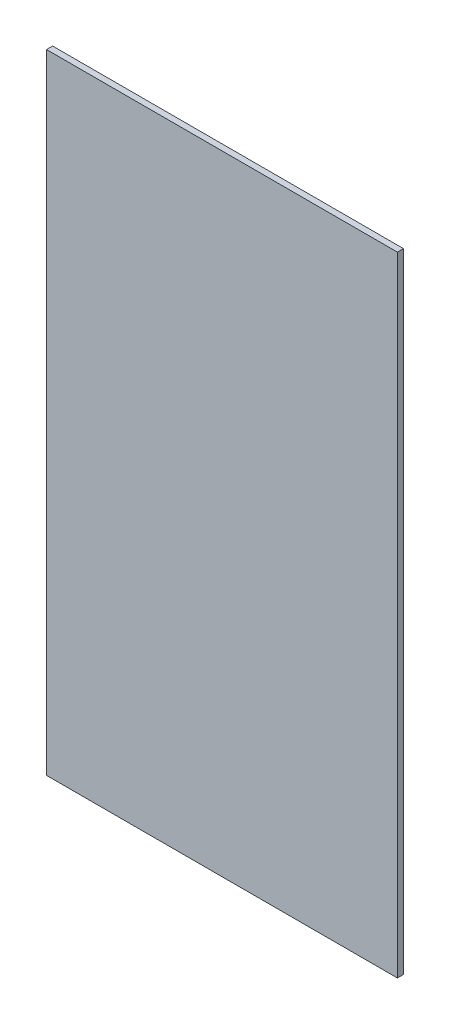
ISO-10303-21;
HEADER;
FILE_DESCRIPTION(('STEP AP214'),'2;1');
FILE_NAME('part.step','',(''),(''),'','','');
FILE_SCHEMA(('AUTOMOTIVE_DESIGN { 1 0 10303 214 1 1 1 1 }'));
ENDSEC;
DATA;
#1=APPLICATION_CONTEXT('core data for automotive mechanical design processes');
#2=APPLICATION_PROTOCOL_DEFINITION('international standard','automotive_design',2000,#1);
#3=PRODUCT_CONTEXT('',#1,'mechanical');
#4=PRODUCT('Part','Part','',(#3));
#5=PRODUCT_RELATED_PRODUCT_CATEGORY('part','',(#4));
#6=PRODUCT_DEFINITION_FORMATION('','',#4);
#7=PRODUCT_DEFINITION_CONTEXT('part definition',#1,'design');
#8=PRODUCT_DEFINITION('design','',#6,#7);
#9=PRODUCT_DEFINITION_SHAPE('','',#8);
#10=(LENGTH_UNIT() NAMED_UNIT(*) SI_UNIT(.MILLI.,.METRE.));
#11=(NAMED_UNIT(*) PLANE_ANGLE_UNIT() SI_UNIT($,.RADIAN.));
#12=(NAMED_UNIT(*) SI_UNIT($,.STERADIAN.) SOLID_ANGLE_UNIT());
#13=UNCERTAINTY_MEASURE_WITH_UNIT(LENGTH_MEASURE(1.E-05),#10,'distance_accuracy_value','');
#14=(GEOMETRIC_REPRESENTATION_CONTEXT(3) GLOBAL_UNCERTAINTY_ASSIGNED_CONTEXT((#13)) GLOBAL_UNIT_ASSIGNED_CONTEXT((#10,
#11,#12)) REPRESENTATION_CONTEXT('',''));
#15=CARTESIAN_POINT('',(0.,0.,0.));
#16=DIRECTION('',(0.,0.,1.));
#17=DIRECTION('',(1.,0.,0.));
#18=AXIS2_PLACEMENT_3D('',#15,#16,#17);
#19=CARTESIAN_POINT('',(57.5,103.,2.));
#20=DIRECTION('',(0.,-1.,0.));
#21=DIRECTION('',(0.,0.,-1.));
#22=AXIS2_PLACEMENT_3D('',#19,#20,#21);
#23=PLANE('',#22);
#24=DIRECTION('',(-1.,0.,0.));
#25=VECTOR('',#24,1.);
#26=CARTESIAN_POINT('',(57.5,103.,0.));
#27=LINE('',#26,#25);
#28=CARTESIAN_POINT('',(57.5,103.,0.));
#29=VERTEX_POINT('',#28);
#30=CARTESIAN_POINT('',(-57.5,103.,0.));
#31=VERTEX_POINT('',#30);
#32=EDGE_CURVE('E113',#29,#31,#27,.T.);
#33=ORIENTED_EDGE('',*,*,#32,.T.);
#34=DIRECTION('',(0.,0.,-1.));
#35=VECTOR('',#34,1.);
#36=CARTESIAN_POINT('',(-57.5,103.,2.));
#37=LINE('',#36,#35);
#38=CARTESIAN_POINT('',(-57.5,103.,2.));
#39=VERTEX_POINT('',#38);
#40=EDGE_CURVE('E11',#39,#31,#37,.T.);
#41=ORIENTED_EDGE('',*,*,#40,.F.);
#42=DIRECTION('',(-1.,0.,0.));
#43=VECTOR('',#42,1.);
#44=CARTESIAN_POINT('',(57.5,103.,2.));
#45=LINE('',#44,#43);
#46=CARTESIAN_POINT('',(57.5,103.,2.));
#47=VERTEX_POINT('',#46);
#48=EDGE_CURVE('E97',#47,#39,#45,.T.);
#49=ORIENTED_EDGE('',*,*,#48,.F.);
#50=DIRECTION('',(0.,0.,-1.));
#51=VECTOR('',#50,1.);
#52=CARTESIAN_POINT('',(57.5,103.,2.));
#53=LINE('',#52,#51);
#54=EDGE_CURVE('E109',#47,#29,#53,.T.);
#55=ORIENTED_EDGE('',*,*,#54,.T.);
#56=EDGE_LOOP('',(#33,#41,#49,#55));
#57=FACE_BOUND('',#56,.T.);
#58=ADVANCED_FACE('F45',(#57),#23,.F.);
#59=CARTESIAN_POINT('',(-57.5,-103.,2.));
#60=DIRECTION('',(1.,0.,0.));
#61=DIRECTION('',(0.,0.,-1.));
#62=AXIS2_PLACEMENT_3D('',#59,#60,#61);
#63=PLANE('',#62);
#64=DIRECTION('',(0.,-1.,0.));
#65=VECTOR('',#64,1.);
#66=CARTESIAN_POINT('',(-57.5,-103.,0.));
#67=LINE('',#66,#65);
#68=CARTESIAN_POINT('',(-57.5,-103.,0.));
#69=VERTEX_POINT('',#68);
#70=EDGE_CURVE('E102',#31,#69,#67,.T.);
#71=ORIENTED_EDGE('',*,*,#70,.T.);
#72=DIRECTION('',(0.,0.,-1.));
#73=VECTOR('',#72,1.);
#74=CARTESIAN_POINT('',(-57.5,-103.,2.));
#75=LINE('',#74,#73);
#76=CARTESIAN_POINT('',(-57.5,-103.,2.));
#77=VERTEX_POINT('',#76);
#78=EDGE_CURVE('E54',#77,#69,#75,.T.);
#79=ORIENTED_EDGE('',*,*,#78,.F.);
#80=DIRECTION('',(0.,-1.,0.));
#81=VECTOR('',#80,1.);
#82=CARTESIAN_POINT('',(-57.5,-103.,2.));
#83=LINE('',#82,#81);
#84=EDGE_CURVE('E92',#39,#77,#83,.T.);
#85=ORIENTED_EDGE('',*,*,#84,.F.);
#86=ORIENTED_EDGE('',*,*,#40,.T.);
#87=EDGE_LOOP('',(#71,#79,#85,#86));
#88=FACE_BOUND('',#87,.T.);
#89=ADVANCED_FACE('F101',(#88),#63,.F.);
#90=CARTESIAN_POINT('',(57.5,-103.,2.));
#91=DIRECTION('',(0.,1.,0.));
#92=DIRECTION('',(0.,0.,1.));
#93=AXIS2_PLACEMENT_3D('',#90,#91,#92);
#94=PLANE('',#93);
#95=DIRECTION('',(1.,0.,0.));
#96=VECTOR('',#95,1.);
#97=CARTESIAN_POINT('',(57.5,-103.,0.));
#98=LINE('',#97,#96);
#99=CARTESIAN_POINT('',(57.5,-103.,0.));
#100=VERTEX_POINT('',#99);
#101=EDGE_CURVE('E79',#69,#100,#98,.T.);
#102=ORIENTED_EDGE('',*,*,#101,.T.);
#103=DIRECTION('',(0.,0.,-1.));
#104=VECTOR('',#103,1.);
#105=CARTESIAN_POINT('',(57.5,-103.,2.));
#106=LINE('',#105,#104);
#107=CARTESIAN_POINT('',(57.5,-103.,2.));
#108=VERTEX_POINT('',#107);
#109=EDGE_CURVE('E104',#108,#100,#106,.T.);
#110=ORIENTED_EDGE('',*,*,#109,.F.);
#111=DIRECTION('',(1.,0.,0.));
#112=VECTOR('',#111,1.);
#113=CARTESIAN_POINT('',(57.5,-103.,2.));
#114=LINE('',#113,#112);
#115=EDGE_CURVE('E95',#77,#108,#114,.T.);
#116=ORIENTED_EDGE('',*,*,#115,.F.);
#117=ORIENTED_EDGE('',*,*,#78,.T.);
#118=EDGE_LOOP('',(#102,#110,#116,#117));
#119=FACE_BOUND('',#118,.T.);
#120=ADVANCED_FACE('F105',(#119),#94,.F.);
#121=CARTESIAN_POINT('',(57.5,-103.,2.));
#122=DIRECTION('',(-1.,0.,0.));
#123=DIRECTION('',(0.,0.,1.));
#124=AXIS2_PLACEMENT_3D('',#121,#122,#123);
#125=PLANE('',#124);
#126=DIRECTION('',(0.,1.,0.));
#127=VECTOR('',#126,1.);
#128=CARTESIAN_POINT('',(57.5,-103.,0.));
#129=LINE('',#128,#127);
#130=EDGE_CURVE('E85',#100,#29,#129,.T.);
#131=ORIENTED_EDGE('',*,*,#130,.T.);
#132=ORIENTED_EDGE('',*,*,#54,.F.);
#133=DIRECTION('',(0.,1.,0.));
#134=VECTOR('',#133,1.);
#135=CARTESIAN_POINT('',(57.5,-103.,2.));
#136=LINE('',#135,#134);
#137=EDGE_CURVE('E62',#108,#47,#136,.T.);
#138=ORIENTED_EDGE('',*,*,#137,.F.);
#139=ORIENTED_EDGE('',*,*,#109,.T.);
#140=EDGE_LOOP('',(#131,#132,#138,#139));
#141=FACE_BOUND('',#140,.T.);
#142=ADVANCED_FACE('F126',(#141),#125,.F.);
#143=CARTESIAN_POINT('',(0.,0.,2.));
#144=DIRECTION('',(0.,0.,-1.));
#145=DIRECTION('',(-1.,0.,0.));
#146=AXIS2_PLACEMENT_3D('',#143,#144,#145);
#147=PLANE('',#146);
#148=ORIENTED_EDGE('',*,*,#48,.T.);
#149=ORIENTED_EDGE('',*,*,#84,.T.);
#150=ORIENTED_EDGE('',*,*,#115,.T.);
#151=ORIENTED_EDGE('',*,*,#137,.T.);
#152=EDGE_LOOP('',(#148,#149,#150,#151));
#153=FACE_BOUND('',#152,.T.);
#154=ADVANCED_FACE('F93',(#153),#147,.F.);
#155=CARTESIAN_POINT('',(0.,0.,0.));
#156=DIRECTION('',(0.,0.,-1.));
#157=DIRECTION('',(-1.,0.,0.));
#158=AXIS2_PLACEMENT_3D('',#155,#156,#157);
#159=PLANE('',#158);
#160=ORIENTED_EDGE('',*,*,#32,.F.);
#161=ORIENTED_EDGE('',*,*,#130,.F.);
#162=ORIENTED_EDGE('',*,*,#101,.F.);
#163=ORIENTED_EDGE('',*,*,#70,.F.);
#164=EDGE_LOOP('',(#160,#161,#162,#163));
#165=FACE_BOUND('',#164,.T.);
#166=ADVANCED_FACE('F129',(#165),#159,.T.);
#167=CLOSED_SHELL('',(#58,#89,#120,#142,#154,#166));
#168=MANIFOLD_SOLID_BREP('B2',#167);
#169=ADVANCED_BREP_SHAPE_REPRESENTATION('',(#18,#168),#14);
#170=SHAPE_DEFINITION_REPRESENTATION(#9,#169);
ENDSEC;
END-ISO-10303-21;
